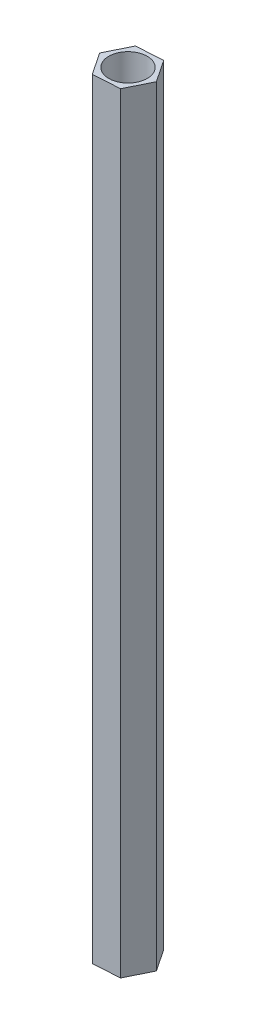
ISO-10303-21;
HEADER;
FILE_DESCRIPTION(('STEP AP214'),'2;1');
FILE_NAME('part.step','',(''),(''),'','','');
FILE_SCHEMA(('AUTOMOTIVE_DESIGN { 1 0 10303 214 1 1 1 1 }'));
ENDSEC;
DATA;
#1=APPLICATION_CONTEXT('core data for automotive mechanical design processes');
#2=APPLICATION_PROTOCOL_DEFINITION('international standard','automotive_design',2000,#1);
#3=PRODUCT_CONTEXT('',#1,'mechanical');
#4=PRODUCT('Part','Part','',(#3));
#5=PRODUCT_RELATED_PRODUCT_CATEGORY('part','',(#4));
#6=PRODUCT_DEFINITION_FORMATION('','',#4);
#7=PRODUCT_DEFINITION_CONTEXT('part definition',#1,'design');
#8=PRODUCT_DEFINITION('design','',#6,#7);
#9=PRODUCT_DEFINITION_SHAPE('','',#8);
#10=(LENGTH_UNIT() NAMED_UNIT(*) SI_UNIT(.MILLI.,.METRE.));
#11=(NAMED_UNIT(*) PLANE_ANGLE_UNIT() SI_UNIT($,.RADIAN.));
#12=(NAMED_UNIT(*) SI_UNIT($,.STERADIAN.) SOLID_ANGLE_UNIT());
#13=UNCERTAINTY_MEASURE_WITH_UNIT(LENGTH_MEASURE(1.E-05),#10,'distance_accuracy_value','');
#14=(GEOMETRIC_REPRESENTATION_CONTEXT(3) GLOBAL_UNCERTAINTY_ASSIGNED_CONTEXT((#13)) GLOBAL_UNIT_ASSIGNED_CONTEXT((#10,
#11,#12)) REPRESENTATION_CONTEXT('',''));
#15=CARTESIAN_POINT('',(0.,0.,0.));
#16=DIRECTION('',(0.,0.,1.));
#17=DIRECTION('',(1.,0.,0.));
#18=AXIS2_PLACEMENT_3D('',#15,#16,#17);
#19=CARTESIAN_POINT('',(0.,50.,0.));
#20=DIRECTION('',(0.,1.,0.));
#21=DIRECTION('',(0.,0.,1.));
#22=AXIS2_PLACEMENT_3D('',#19,#20,#21);
#23=PLANE('',#22);
#24=DIRECTION('',(0.997926790235506,0.,-0.0643593142463475));
#25=VECTOR('',#24,1.);
#26=CARTESIAN_POINT('',(-0.767690980091492,50.,1.55262698646074));
#27=LINE('',#26,#25);
#28=CARTESIAN_POINT('',(-0.767690980091492,50.,1.55262698646074));
#29=VERTEX_POINT('',#28);
#30=CARTESIAN_POINT('',(0.960768922830534,50.,1.44115338424578));
#31=VERTEX_POINT('',#30);
#32=EDGE_CURVE('E132',#29,#31,#27,.T.);
#33=ORIENTED_EDGE('',*,*,#32,.T.);
#34=DIRECTION('',(0.44322659401027,0.,-0.896409608584187));
#35=VECTOR('',#34,1.);
#36=CARTESIAN_POINT('',(0.960768922830534,50.,1.44115338424578));
#37=LINE('',#36,#35);
#38=CARTESIAN_POINT('',(1.72845990292203,50.,-0.111473602214965));
#39=VERTEX_POINT('',#38);
#40=EDGE_CURVE('E90',#31,#39,#37,.T.);
#41=ORIENTED_EDGE('',*,*,#40,.T.);
#42=DIRECTION('',(-0.554700196225236,0.,-0.832050294337839));
#43=VECTOR('',#42,1.);
#44=CARTESIAN_POINT('',(1.72845990292203,50.,-0.111473602214965));
#45=LINE('',#44,#43);
#46=CARTESIAN_POINT('',(0.767690980091492,50.,-1.55262698646074));
#47=VERTEX_POINT('',#46);
#48=EDGE_CURVE('E103',#39,#47,#45,.T.);
#49=ORIENTED_EDGE('',*,*,#48,.T.);
#50=DIRECTION('',(-0.997926790235506,0.,0.0643593142463474));
#51=VECTOR('',#50,1.);
#52=CARTESIAN_POINT('',(0.767690980091492,50.,-1.55262698646074));
#53=LINE('',#52,#51);
#54=CARTESIAN_POINT('',(-0.960768922830534,50.,-1.44115338424578));
#55=VERTEX_POINT('',#54);
#56=EDGE_CURVE('E97',#47,#55,#53,.T.);
#57=ORIENTED_EDGE('',*,*,#56,.T.);
#58=DIRECTION('',(-0.443226594010271,0.,0.896409608584187));
#59=VECTOR('',#58,1.);
#60=CARTESIAN_POINT('',(-0.960768922830534,50.,-1.44115338424578));
#61=LINE('',#60,#59);
#62=CARTESIAN_POINT('',(-1.72845990292203,50.,0.111473602214965));
#63=VERTEX_POINT('',#62);
#64=EDGE_CURVE('E101',#55,#63,#61,.T.);
#65=ORIENTED_EDGE('',*,*,#64,.T.);
#66=DIRECTION('',(0.554700196225236,0.,0.832050294337839));
#67=VECTOR('',#66,1.);
#68=CARTESIAN_POINT('',(-1.72845990292203,50.,0.111473602214965));
#69=LINE('',#68,#67);
#70=EDGE_CURVE('E53',#63,#29,#69,.T.);
#71=ORIENTED_EDGE('',*,*,#70,.T.);
#72=EDGE_LOOP('',(#33,#41,#49,#57,#65,#71));
#73=FACE_BOUND('',#72,.T.);
#74=CARTESIAN_POINT('',(0.,50.,0.));
#75=DIRECTION('',(0.,1.,0.));
#76=DIRECTION('',(0.,0.,1.));
#77=AXIS2_PLACEMENT_3D('',#74,#75,#76);
#78=CIRCLE('',#77,1.25);
#79=CARTESIAN_POINT('',(0.,50.,1.25));
#80=VERTEX_POINT('',#79);
#81=EDGE_CURVE('E125',#80,#80,#78,.T.);
#82=ORIENTED_EDGE('',*,*,#81,.F.);
#83=EDGE_LOOP('',(#82));
#84=FACE_BOUND('',#83,.T.);
#85=ADVANCED_FACE('F36',(#73,#84),#23,.T.);
#86=CARTESIAN_POINT('',(0.,0.,0.));
#87=DIRECTION('',(0.,1.,0.));
#88=DIRECTION('',(0.,0.,1.));
#89=AXIS2_PLACEMENT_3D('',#86,#87,#88);
#90=PLANE('',#89);
#91=DIRECTION('',(0.997926790235506,0.,-0.0643593142463475));
#92=VECTOR('',#91,1.);
#93=CARTESIAN_POINT('',(-0.767690980091492,0.,1.55262698646074));
#94=LINE('',#93,#92);
#95=CARTESIAN_POINT('',(-0.767690980091492,0.,1.55262698646074));
#96=VERTEX_POINT('',#95);
#97=CARTESIAN_POINT('',(0.960768922830534,0.,1.44115338424578));
#98=VERTEX_POINT('',#97);
#99=EDGE_CURVE('E121',#96,#98,#94,.T.);
#100=ORIENTED_EDGE('',*,*,#99,.F.);
#101=DIRECTION('',(0.554700196225236,0.,0.832050294337839));
#102=VECTOR('',#101,1.);
#103=CARTESIAN_POINT('',(-1.72845990292203,0.,0.111473602214965));
#104=LINE('',#103,#102);
#105=CARTESIAN_POINT('',(-1.72845990292203,0.,0.111473602214965));
#106=VERTEX_POINT('',#105);
#107=EDGE_CURVE('E82',#106,#96,#104,.T.);
#108=ORIENTED_EDGE('',*,*,#107,.F.);
#109=DIRECTION('',(-0.443226594010271,0.,0.896409608584187));
#110=VECTOR('',#109,1.);
#111=CARTESIAN_POINT('',(-0.960768922830534,0.,-1.44115338424578));
#112=LINE('',#111,#110);
#113=CARTESIAN_POINT('',(-0.960768922830534,0.,-1.44115338424578));
#114=VERTEX_POINT('',#113);
#115=EDGE_CURVE('E76',#114,#106,#112,.T.);
#116=ORIENTED_EDGE('',*,*,#115,.F.);
#117=DIRECTION('',(-0.997926790235506,0.,0.0643593142463474));
#118=VECTOR('',#117,1.);
#119=CARTESIAN_POINT('',(0.767690980091492,0.,-1.55262698646074));
#120=LINE('',#119,#118);
#121=CARTESIAN_POINT('',(0.767690980091492,0.,-1.55262698646074));
#122=VERTEX_POINT('',#121);
#123=EDGE_CURVE('E111',#122,#114,#120,.T.);
#124=ORIENTED_EDGE('',*,*,#123,.F.);
#125=DIRECTION('',(-0.554700196225236,0.,-0.832050294337839));
#126=VECTOR('',#125,1.);
#127=CARTESIAN_POINT('',(1.72845990292203,0.,-0.111473602214965));
#128=LINE('',#127,#126);
#129=CARTESIAN_POINT('',(1.72845990292203,0.,-0.111473602214965));
#130=VERTEX_POINT('',#129);
#131=EDGE_CURVE('E127',#130,#122,#128,.T.);
#132=ORIENTED_EDGE('',*,*,#131,.F.);
#133=DIRECTION('',(0.44322659401027,0.,-0.896409608584187));
#134=VECTOR('',#133,1.);
#135=CARTESIAN_POINT('',(0.960768922830534,0.,1.44115338424578));
#136=LINE('',#135,#134);
#137=EDGE_CURVE('E124',#98,#130,#136,.T.);
#138=ORIENTED_EDGE('',*,*,#137,.F.);
#139=EDGE_LOOP('',(#100,#108,#116,#124,#132,#138));
#140=FACE_BOUND('',#139,.T.);
#141=CARTESIAN_POINT('',(0.,0.,0.));
#142=DIRECTION('',(0.,1.,0.));
#143=DIRECTION('',(0.,0.,1.));
#144=AXIS2_PLACEMENT_3D('',#141,#142,#143);
#145=CIRCLE('',#144,1.25);
#146=CARTESIAN_POINT('',(0.,0.,1.25));
#147=VERTEX_POINT('',#146);
#148=EDGE_CURVE('E225',#147,#147,#145,.T.);
#149=ORIENTED_EDGE('',*,*,#148,.T.);
#150=EDGE_LOOP('',(#149));
#151=FACE_BOUND('',#150,.T.);
#152=ADVANCED_FACE('F141',(#140,#151),#90,.F.);
#153=CARTESIAN_POINT('',(-0.767690980091492,50.,1.55262698646074));
#154=DIRECTION('',(-0.0643593142463475,0.,-0.997926790235506));
#155=DIRECTION('',(-0.997926790235506,0.,0.0643593142463475));
#156=AXIS2_PLACEMENT_3D('',#153,#154,#155);
#157=PLANE('',#156);
#158=ORIENTED_EDGE('',*,*,#99,.T.);
#159=DIRECTION('',(0.,-1.,0.));
#160=VECTOR('',#159,1.);
#161=CARTESIAN_POINT('',(0.960768922830534,50.,1.44115338424578));
#162=LINE('',#161,#160);
#163=EDGE_CURVE('E11',#31,#98,#162,.T.);
#164=ORIENTED_EDGE('',*,*,#163,.F.);
#165=ORIENTED_EDGE('',*,*,#32,.F.);
#166=DIRECTION('',(0.,-1.,0.));
#167=VECTOR('',#166,1.);
#168=CARTESIAN_POINT('',(-0.767690980091492,50.,1.55262698646074));
#169=LINE('',#168,#167);
#170=EDGE_CURVE('E117',#29,#96,#169,.T.);
#171=ORIENTED_EDGE('',*,*,#170,.T.);
#172=EDGE_LOOP('',(#158,#164,#165,#171));
#173=FACE_BOUND('',#172,.T.);
#174=ADVANCED_FACE('F38',(#173),#157,.F.);
#175=CARTESIAN_POINT('',(0.960768922830534,50.,1.44115338424578));
#176=DIRECTION('',(-0.896409608584187,0.,-0.44322659401027));
#177=DIRECTION('',(-0.44322659401027,0.,0.896409608584187));
#178=AXIS2_PLACEMENT_3D('',#175,#176,#177);
#179=PLANE('',#178);
#180=ORIENTED_EDGE('',*,*,#137,.T.);
#181=DIRECTION('',(0.,-1.,0.));
#182=VECTOR('',#181,1.);
#183=CARTESIAN_POINT('',(1.72845990292203,50.,-0.111473602214965));
#184=LINE('',#183,#182);
#185=EDGE_CURVE('E45',#39,#130,#184,.T.);
#186=ORIENTED_EDGE('',*,*,#185,.F.);
#187=ORIENTED_EDGE('',*,*,#40,.F.);
#188=ORIENTED_EDGE('',*,*,#163,.T.);
#189=EDGE_LOOP('',(#180,#186,#187,#188));
#190=FACE_BOUND('',#189,.T.);
#191=ADVANCED_FACE('F166',(#190),#179,.F.);
#192=CARTESIAN_POINT('',(1.72845990292203,50.,-0.111473602214965));
#193=DIRECTION('',(-0.832050294337839,0.,0.554700196225236));
#194=DIRECTION('',(0.554700196225236,0.,0.832050294337839));
#195=AXIS2_PLACEMENT_3D('',#192,#193,#194);
#196=PLANE('',#195);
#197=ORIENTED_EDGE('',*,*,#131,.T.);
#198=DIRECTION('',(0.,-1.,0.));
#199=VECTOR('',#198,1.);
#200=CARTESIAN_POINT('',(0.767690980091492,50.,-1.55262698646074));
#201=LINE('',#200,#199);
#202=EDGE_CURVE('E112',#47,#122,#201,.T.);
#203=ORIENTED_EDGE('',*,*,#202,.F.);
#204=ORIENTED_EDGE('',*,*,#48,.F.);
#205=ORIENTED_EDGE('',*,*,#185,.T.);
#206=EDGE_LOOP('',(#197,#203,#204,#205));
#207=FACE_BOUND('',#206,.T.);
#208=ADVANCED_FACE('F138',(#207),#196,.F.);
#209=CARTESIAN_POINT('',(0.767690980091492,50.,-1.55262698646074));
#210=DIRECTION('',(0.0643593142463474,0.,0.997926790235506));
#211=DIRECTION('',(0.997926790235506,0.,-0.0643593142463474));
#212=AXIS2_PLACEMENT_3D('',#209,#210,#211);
#213=PLANE('',#212);
#214=ORIENTED_EDGE('',*,*,#123,.T.);
#215=DIRECTION('',(0.,-1.,0.));
#216=VECTOR('',#215,1.);
#217=CARTESIAN_POINT('',(-0.960768922830534,50.,-1.44115338424578));
#218=LINE('',#217,#216);
#219=EDGE_CURVE('E108',#55,#114,#218,.T.);
#220=ORIENTED_EDGE('',*,*,#219,.F.);
#221=ORIENTED_EDGE('',*,*,#56,.F.);
#222=ORIENTED_EDGE('',*,*,#202,.T.);
#223=EDGE_LOOP('',(#214,#220,#221,#222));
#224=FACE_BOUND('',#223,.T.);
#225=ADVANCED_FACE('F109',(#224),#213,.F.);
#226=CARTESIAN_POINT('',(-0.960768922830534,50.,-1.44115338424578));
#227=DIRECTION('',(0.896409608584187,0.,0.443226594010271));
#228=DIRECTION('',(0.443226594010271,0.,-0.896409608584187));
#229=AXIS2_PLACEMENT_3D('',#226,#227,#228);
#230=PLANE('',#229);
#231=ORIENTED_EDGE('',*,*,#115,.T.);
#232=DIRECTION('',(0.,-1.,0.));
#233=VECTOR('',#232,1.);
#234=CARTESIAN_POINT('',(-1.72845990292203,50.,0.111473602214965));
#235=LINE('',#234,#233);
#236=EDGE_CURVE('E113',#63,#106,#235,.T.);
#237=ORIENTED_EDGE('',*,*,#236,.F.);
#238=ORIENTED_EDGE('',*,*,#64,.F.);
#239=ORIENTED_EDGE('',*,*,#219,.T.);
#240=EDGE_LOOP('',(#231,#237,#238,#239));
#241=FACE_BOUND('',#240,.T.);
#242=ADVANCED_FACE('F115',(#241),#230,.F.);
#243=CARTESIAN_POINT('',(-1.72845990292203,50.,0.111473602214965));
#244=DIRECTION('',(0.832050294337839,0.,-0.554700196225236));
#245=DIRECTION('',(-0.554700196225236,0.,-0.832050294337839));
#246=AXIS2_PLACEMENT_3D('',#243,#244,#245);
#247=PLANE('',#246);
#248=ORIENTED_EDGE('',*,*,#107,.T.);
#249=ORIENTED_EDGE('',*,*,#170,.F.);
#250=ORIENTED_EDGE('',*,*,#70,.F.);
#251=ORIENTED_EDGE('',*,*,#236,.T.);
#252=EDGE_LOOP('',(#248,#249,#250,#251));
#253=FACE_BOUND('',#252,.T.);
#254=ADVANCED_FACE('F146',(#253),#247,.F.);
#255=CARTESIAN_POINT('',(0.,50.,0.));
#256=DIRECTION('',(0.,-1.,0.));
#257=DIRECTION('',(0.,0.,-1.));
#258=AXIS2_PLACEMENT_3D('',#255,#256,#257);
#259=CYLINDRICAL_SURFACE('',#258,1.25);
#260=ORIENTED_EDGE('',*,*,#81,.T.);
#261=EDGE_LOOP('',(#260));
#262=FACE_BOUND('',#261,.T.);
#263=ORIENTED_EDGE('',*,*,#148,.F.);
#264=EDGE_LOOP('',(#263));
#265=FACE_BOUND('',#264,.T.);
#266=ADVANCED_FACE('F148',(#262,#265),#259,.F.);
#267=CLOSED_SHELL('',(#85,#152,#174,#191,#208,#225,#242,#254,#266));
#268=MANIFOLD_SOLID_BREP('B2',#267);
#269=ADVANCED_BREP_SHAPE_REPRESENTATION('',(#18,#268),#14);
#270=SHAPE_DEFINITION_REPRESENTATION(#9,#269);
ENDSEC;
END-ISO-10303-21;
